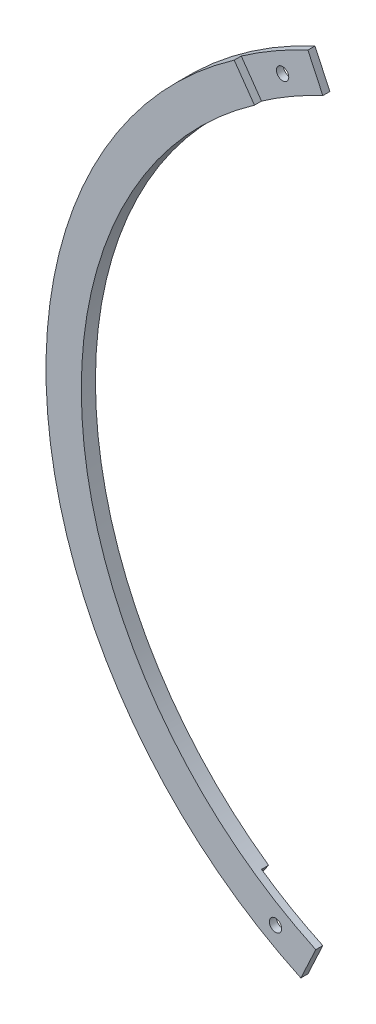
ISO-10303-21;
HEADER;
FILE_DESCRIPTION(('STEP AP214'),'2;1');
FILE_NAME('part.step','',(''),(''),'','','');
FILE_SCHEMA(('AUTOMOTIVE_DESIGN { 1 0 10303 214 1 1 1 1 }'));
ENDSEC;
DATA;
#1=APPLICATION_CONTEXT('core data for automotive mechanical design processes');
#2=APPLICATION_PROTOCOL_DEFINITION('international standard','automotive_design',2000,#1);
#3=PRODUCT_CONTEXT('',#1,'mechanical');
#4=PRODUCT('Part','Part','',(#3));
#5=PRODUCT_RELATED_PRODUCT_CATEGORY('part','',(#4));
#6=PRODUCT_DEFINITION_FORMATION('','',#4);
#7=PRODUCT_DEFINITION_CONTEXT('part definition',#1,'design');
#8=PRODUCT_DEFINITION('design','',#6,#7);
#9=PRODUCT_DEFINITION_SHAPE('','',#8);
#10=(LENGTH_UNIT() NAMED_UNIT(*) SI_UNIT(.MILLI.,.METRE.));
#11=(NAMED_UNIT(*) PLANE_ANGLE_UNIT() SI_UNIT($,.RADIAN.));
#12=(NAMED_UNIT(*) SI_UNIT($,.STERADIAN.) SOLID_ANGLE_UNIT());
#13=UNCERTAINTY_MEASURE_WITH_UNIT(LENGTH_MEASURE(1.E-05),#10,'distance_accuracy_value','');
#14=(GEOMETRIC_REPRESENTATION_CONTEXT(3) GLOBAL_UNCERTAINTY_ASSIGNED_CONTEXT((#13)) GLOBAL_UNIT_ASSIGNED_CONTEXT((#10,
#11,#12)) REPRESENTATION_CONTEXT('',''));
#15=CARTESIAN_POINT('',(0.,0.,0.));
#16=DIRECTION('',(0.,0.,1.));
#17=DIRECTION('',(1.,0.,0.));
#18=AXIS2_PLACEMENT_3D('',#15,#16,#17);
#19=CARTESIAN_POINT('',(0.,0.,4.));
#20=DIRECTION('',(0.,0.,-1.));
#21=DIRECTION('',(-1.,0.,0.));
#22=AXIS2_PLACEMENT_3D('',#19,#20,#21);
#23=CYLINDRICAL_SURFACE('',#22,125.);
#24=CARTESIAN_POINT('',(0.,0.,0.));
#25=DIRECTION('',(0.,0.,1.));
#26=DIRECTION('',(1.,0.,0.));
#27=AXIS2_PLACEMENT_3D('',#24,#25,#26);
#28=CIRCLE('',#27,125.);
#29=CARTESIAN_POINT('',(-52.827282717588,113.288473379581,0.));
#30=VERTEX_POINT('',#29);
#31=CARTESIAN_POINT('',(-71.697054543881,-102.394005536124,0.));
#32=VERTEX_POINT('',#31);
#33=EDGE_CURVE('E145',#30,#32,#28,.T.);
#34=ORIENTED_EDGE('',*,*,#33,.T.);
#35=DIRECTION('',(0.,0.,-1.));
#36=VECTOR('',#35,1.);
#37=CARTESIAN_POINT('',(-71.697054543881,-102.394005536124,2.));
#38=LINE('',#37,#36);
#39=CARTESIAN_POINT('',(-71.697054543881,-102.394005536124,2.));
#40=VERTEX_POINT('',#39);
#41=EDGE_CURVE('E56',#40,#32,#38,.T.);
#42=ORIENTED_EDGE('',*,*,#41,.F.);
#43=CARTESIAN_POINT('',(0.,0.,2.));
#44=DIRECTION('',(0.,0.,-1.));
#45=DIRECTION('',(1.,0.,0.));
#46=AXIS2_PLACEMENT_3D('',#43,#44,#45);
#47=CIRCLE('',#46,125.);
#48=CARTESIAN_POINT('',(-52.827282717588,-113.288473379581,2.));
#49=VERTEX_POINT('',#48);
#50=EDGE_CURVE('E127',#49,#40,#47,.T.);
#51=ORIENTED_EDGE('',*,*,#50,.F.);
#52=DIRECTION('',(0.,0.,-1.));
#53=VECTOR('',#52,1.);
#54=CARTESIAN_POINT('',(-52.827282717588,-113.288473379581,4.));
#55=LINE('',#54,#53);
#56=CARTESIAN_POINT('',(-52.827282717588,-113.288473379581,4.));
#57=VERTEX_POINT('',#56);
#58=EDGE_CURVE('E11',#57,#49,#55,.T.);
#59=ORIENTED_EDGE('',*,*,#58,.F.);
#60=CARTESIAN_POINT('',(0.,0.,4.));
#61=DIRECTION('',(0.,0.,1.));
#62=DIRECTION('',(1.,0.,0.));
#63=AXIS2_PLACEMENT_3D('',#60,#61,#62);
#64=CIRCLE('',#63,125.);
#65=CARTESIAN_POINT('',(-71.6970545438813,102.394005536124,4.));
#66=VERTEX_POINT('',#65);
#67=EDGE_CURVE('E166',#66,#57,#64,.T.);
#68=ORIENTED_EDGE('',*,*,#67,.F.);
#69=DIRECTION('',(0.,0.,1.));
#70=VECTOR('',#69,1.);
#71=CARTESIAN_POINT('',(-71.6970545438814,102.394005536124,2.));
#72=LINE('',#71,#70);
#73=CARTESIAN_POINT('',(-71.6970545438814,102.394005536124,2.));
#74=VERTEX_POINT('',#73);
#75=EDGE_CURVE('E64',#74,#66,#72,.T.);
#76=ORIENTED_EDGE('',*,*,#75,.F.);
#77=CARTESIAN_POINT('',(0.,0.,2.));
#78=DIRECTION('',(0.,0.,1.));
#79=DIRECTION('',(-1.,0.,0.));
#80=AXIS2_PLACEMENT_3D('',#77,#78,#79);
#81=CIRCLE('',#80,125.);
#82=CARTESIAN_POINT('',(-52.827282717588,113.288473379581,2.));
#83=VERTEX_POINT('',#82);
#84=EDGE_CURVE('E189',#83,#74,#81,.T.);
#85=ORIENTED_EDGE('',*,*,#84,.F.);
#86=DIRECTION('',(0.,0.,-1.));
#87=VECTOR('',#86,1.);
#88=CARTESIAN_POINT('',(-52.827282717588,113.288473379581,4.));
#89=LINE('',#88,#87);
#90=EDGE_CURVE('E138',#83,#30,#89,.T.);
#91=ORIENTED_EDGE('',*,*,#90,.T.);
#92=EDGE_LOOP('',(#34,#42,#51,#59,#68,#76,#85,#91));
#93=FACE_BOUND('',#92,.T.);
#94=ADVANCED_FACE('F39',(#93),#23,.T.);
#95=CARTESIAN_POINT('',(-48.6011001001809,-104.225395509215,4.));
#96=DIRECTION('',(-0.906307787036648,0.422618261740703,0.));
#97=DIRECTION('',(-0.422618261740703,-0.906307787036648,0.));
#98=AXIS2_PLACEMENT_3D('',#95,#96,#97);
#99=PLANE('',#98);
#100=ORIENTED_EDGE('',*,*,#58,.T.);
#101=DIRECTION('',(-0.422618261740696,-0.906307787036651,0.));
#102=VECTOR('',#101,1.);
#103=CARTESIAN_POINT('',(-48.601100100181,-104.225395509215,2.));
#104=LINE('',#103,#102);
#105=CARTESIAN_POINT('',(-48.601100100181,-104.225395509215,2.));
#106=VERTEX_POINT('',#105);
#107=EDGE_CURVE('E111',#106,#49,#104,.T.);
#108=ORIENTED_EDGE('',*,*,#107,.F.);
#109=DIRECTION('',(0.,0.,-1.));
#110=VECTOR('',#109,1.);
#111=CARTESIAN_POINT('',(-48.601100100181,-104.225395509215,4.));
#112=LINE('',#111,#110);
#113=CARTESIAN_POINT('',(-48.601100100181,-104.225395509215,4.));
#114=VERTEX_POINT('',#113);
#115=EDGE_CURVE('E48',#114,#106,#112,.T.);
#116=ORIENTED_EDGE('',*,*,#115,.F.);
#117=DIRECTION('',(0.422618261740703,0.906307787036648,0.));
#118=VECTOR('',#117,1.);
#119=CARTESIAN_POINT('',(-48.6011001001809,-104.225395509215,4.));
#120=LINE('',#119,#118);
#121=EDGE_CURVE('E169',#57,#114,#120,.T.);
#122=ORIENTED_EDGE('',*,*,#121,.F.);
#123=EDGE_LOOP('',(#100,#108,#116,#122));
#124=FACE_BOUND('',#123,.T.);
#125=ADVANCED_FACE('F122',(#124),#99,.F.);
#126=CARTESIAN_POINT('',(0.,0.,4.));
#127=DIRECTION('',(0.,0.,-1.));
#128=DIRECTION('',(-1.,0.,0.));
#129=AXIS2_PLACEMENT_3D('',#126,#127,#128);
#130=CYLINDRICAL_SURFACE('',#129,115.);
#131=CARTESIAN_POINT('',(0.,0.,2.));
#132=DIRECTION('',(0.,0.,1.));
#133=DIRECTION('',(1.,0.,0.));
#134=AXIS2_PLACEMENT_3D('',#131,#132,#133);
#135=CIRCLE('',#134,115.);
#136=CARTESIAN_POINT('',(-65.9612901803705,-94.2024850932339,2.));
#137=VERTEX_POINT('',#136);
#138=EDGE_CURVE('E107',#137,#106,#135,.T.);
#139=ORIENTED_EDGE('',*,*,#138,.F.);
#140=DIRECTION('',(0.,0.,-1.));
#141=VECTOR('',#140,1.);
#142=CARTESIAN_POINT('',(-65.9612901803705,-94.2024850932339,2.));
#143=LINE('',#142,#141);
#144=CARTESIAN_POINT('',(-65.9612901803705,-94.2024850932339,0.));
#145=VERTEX_POINT('',#144);
#146=EDGE_CURVE('E199',#137,#145,#143,.T.);
#147=ORIENTED_EDGE('',*,*,#146,.T.);
#148=CARTESIAN_POINT('',(0.,0.,0.));
#149=DIRECTION('',(0.,0.,-1.));
#150=DIRECTION('',(1.,0.,0.));
#151=AXIS2_PLACEMENT_3D('',#148,#149,#150);
#152=CIRCLE('',#151,115.);
#153=CARTESIAN_POINT('',(-48.601100100181,104.225395509215,0.));
#154=VERTEX_POINT('',#153);
#155=EDGE_CURVE('E178',#145,#154,#152,.T.);
#156=ORIENTED_EDGE('',*,*,#155,.T.);
#157=DIRECTION('',(0.,0.,-1.));
#158=VECTOR('',#157,1.);
#159=CARTESIAN_POINT('',(-48.601100100181,104.225395509215,4.));
#160=LINE('',#159,#158);
#161=CARTESIAN_POINT('',(-48.601100100181,104.225395509214,2.));
#162=VERTEX_POINT('',#161);
#163=EDGE_CURVE('E134',#162,#154,#160,.T.);
#164=ORIENTED_EDGE('',*,*,#163,.F.);
#165=CARTESIAN_POINT('',(0.,0.,2.));
#166=DIRECTION('',(0.,0.,-1.));
#167=DIRECTION('',(1.,0.,0.));
#168=AXIS2_PLACEMENT_3D('',#165,#166,#167);
#169=CIRCLE('',#168,115.);
#170=CARTESIAN_POINT('',(-65.9612901803709,94.2024850932336,2.));
#171=VERTEX_POINT('',#170);
#172=EDGE_CURVE('E198',#171,#162,#169,.T.);
#173=ORIENTED_EDGE('',*,*,#172,.F.);
#174=DIRECTION('',(0.,0.,1.));
#175=VECTOR('',#174,1.);
#176=CARTESIAN_POINT('',(-65.9612901803709,94.2024850932336,2.));
#177=LINE('',#176,#175);
#178=CARTESIAN_POINT('',(-65.9612901803709,94.2024850932336,4.));
#179=VERTEX_POINT('',#178);
#180=EDGE_CURVE('E150',#171,#179,#177,.T.);
#181=ORIENTED_EDGE('',*,*,#180,.T.);
#182=CARTESIAN_POINT('',(0.,0.,4.));
#183=DIRECTION('',(0.,0.,-1.));
#184=DIRECTION('',(1.,0.,0.));
#185=AXIS2_PLACEMENT_3D('',#182,#183,#184);
#186=CIRCLE('',#185,115.);
#187=EDGE_CURVE('E132',#114,#179,#186,.T.);
#188=ORIENTED_EDGE('',*,*,#187,.F.);
#189=ORIENTED_EDGE('',*,*,#115,.T.);
#190=EDGE_LOOP('',(#139,#147,#156,#164,#173,#181,#188,#189));
#191=FACE_BOUND('',#190,.T.);
#192=ADVANCED_FACE('F129',(#191),#130,.F.);
#193=CARTESIAN_POINT('',(-48.601100100181,104.225395509215,4.));
#194=DIRECTION('',(-0.906307787036648,-0.422618261740704,0.));
#195=DIRECTION('',(0.422618261740704,-0.906307787036648,0.));
#196=AXIS2_PLACEMENT_3D('',#193,#194,#195);
#197=PLANE('',#196);
#198=ORIENTED_EDGE('',*,*,#90,.F.);
#199=DIRECTION('',(-0.422618261740704,0.906307787036648,0.));
#200=VECTOR('',#199,1.);
#201=CARTESIAN_POINT('',(-52.827282717588,113.288473379581,2.));
#202=LINE('',#201,#200);
#203=EDGE_CURVE('E160',#162,#83,#202,.T.);
#204=ORIENTED_EDGE('',*,*,#203,.F.);
#205=ORIENTED_EDGE('',*,*,#163,.T.);
#206=DIRECTION('',(-0.422618261740704,0.906307787036648,0.));
#207=VECTOR('',#206,1.);
#208=CARTESIAN_POINT('',(-48.601100100181,104.225395509215,0.));
#209=LINE('',#208,#207);
#210=EDGE_CURVE('E170',#154,#30,#209,.T.);
#211=ORIENTED_EDGE('',*,*,#210,.T.);
#212=EDGE_LOOP('',(#198,#204,#205,#211));
#213=FACE_BOUND('',#212,.T.);
#214=ADVANCED_FACE('F196',(#213),#197,.F.);
#215=CARTESIAN_POINT('',(0.,0.,4.));
#216=DIRECTION('',(0.,0.,1.));
#217=DIRECTION('',(1.,0.,0.));
#218=AXIS2_PLACEMENT_3D('',#215,#216,#217);
#219=PLANE('',#218);
#220=DIRECTION('',(0.57357643635105,-0.819152044288989,0.));
#221=VECTOR('',#220,1.);
#222=CARTESIAN_POINT('',(-71.6970545438814,102.394005536124,4.));
#223=LINE('',#222,#221);
#224=EDGE_CURVE('E163',#66,#179,#223,.T.);
#225=ORIENTED_EDGE('',*,*,#224,.F.);
#226=ORIENTED_EDGE('',*,*,#67,.T.);
#227=ORIENTED_EDGE('',*,*,#121,.T.);
#228=ORIENTED_EDGE('',*,*,#187,.T.);
#229=EDGE_LOOP('',(#225,#226,#227,#228));
#230=FACE_BOUND('',#229,.T.);
#231=CARTESIAN_POINT('',(-59.9999999999997,-103.923048454133,4.));
#232=DIRECTION('',(0.,0.,1.));
#233=DIRECTION('',(1.,0.,0.));
#234=AXIS2_PLACEMENT_3D('',#231,#232,#233);
#235=CIRCLE('',#234,1.75000000000006);
#236=CARTESIAN_POINT('',(-58.2499999999996,-103.923048454133,4.));
#237=VERTEX_POINT('',#236);
#238=EDGE_CURVE('E146',#237,#237,#235,.T.);
#239=ORIENTED_EDGE('',*,*,#238,.F.);
#240=EDGE_LOOP('',(#239));
#241=FACE_BOUND('',#240,.T.);
#242=ADVANCED_FACE('F224',(#230,#241),#219,.T.);
#243=CARTESIAN_POINT('',(0.,0.,0.));
#244=DIRECTION('',(0.,0.,1.));
#245=DIRECTION('',(1.,0.,0.));
#246=AXIS2_PLACEMENT_3D('',#243,#244,#245);
#247=PLANE('',#246);
#248=CARTESIAN_POINT('',(-60.0000000000005,103.923048454132,0.));
#249=DIRECTION('',(0.,0.,1.));
#250=DIRECTION('',(1.,0.,0.));
#251=AXIS2_PLACEMENT_3D('',#248,#249,#250);
#252=CIRCLE('',#251,1.74999999999996);
#253=CARTESIAN_POINT('',(-58.2500000000006,103.923048454132,0.));
#254=VERTEX_POINT('',#253);
#255=EDGE_CURVE('E142',#254,#254,#252,.T.);
#256=ORIENTED_EDGE('',*,*,#255,.T.);
#257=EDGE_LOOP('',(#256));
#258=FACE_BOUND('',#257,.T.);
#259=ORIENTED_EDGE('',*,*,#155,.F.);
#260=DIRECTION('',(0.573576436351046,0.819152044288992,0.));
#261=VECTOR('',#260,1.);
#262=CARTESIAN_POINT('',(-65.9612901803705,-94.2024850932339,0.));
#263=LINE('',#262,#261);
#264=EDGE_CURVE('E118',#32,#145,#263,.T.);
#265=ORIENTED_EDGE('',*,*,#264,.F.);
#266=ORIENTED_EDGE('',*,*,#33,.F.);
#267=ORIENTED_EDGE('',*,*,#210,.F.);
#268=EDGE_LOOP('',(#259,#265,#266,#267));
#269=FACE_BOUND('',#268,.T.);
#270=ADVANCED_FACE('F195',(#258,#269),#247,.F.);
#271=CARTESIAN_POINT('',(-59.9999999999997,-103.923048454133,-6.));
#272=DIRECTION('',(0.,0.,1.));
#273=DIRECTION('',(1.,0.,0.));
#274=AXIS2_PLACEMENT_3D('',#271,#272,#273);
#275=CYLINDRICAL_SURFACE('',#274,1.75000000000006);
#276=CARTESIAN_POINT('',(-59.9999999999997,-103.923048454133,2.));
#277=DIRECTION('',(0.,0.,1.));
#278=DIRECTION('',(1.,0.,0.));
#279=AXIS2_PLACEMENT_3D('',#276,#277,#278);
#280=CIRCLE('',#279,1.75000000000006);
#281=CARTESIAN_POINT('',(-58.2499999999996,-103.923048454133,2.));
#282=VERTEX_POINT('',#281);
#283=EDGE_CURVE('E42',#282,#282,#280,.F.);
#284=ORIENTED_EDGE('',*,*,#283,.T.);
#285=EDGE_LOOP('',(#284));
#286=FACE_BOUND('',#285,.T.);
#287=ORIENTED_EDGE('',*,*,#238,.T.);
#288=EDGE_LOOP('',(#287));
#289=FACE_BOUND('',#288,.T.);
#290=ADVANCED_FACE('F251',(#286,#289),#275,.F.);
#291=CARTESIAN_POINT('',(-60.0000000000005,103.923048454132,-6.));
#292=DIRECTION('',(0.,0.,1.));
#293=DIRECTION('',(1.,0.,0.));
#294=AXIS2_PLACEMENT_3D('',#291,#292,#293);
#295=CYLINDRICAL_SURFACE('',#294,1.74999999999996);
#296=CARTESIAN_POINT('',(-60.0000000000005,103.923048454132,2.));
#297=DIRECTION('',(0.,0.,-1.));
#298=DIRECTION('',(-1.,0.,0.));
#299=AXIS2_PLACEMENT_3D('',#296,#297,#298);
#300=CIRCLE('',#299,1.74999999999996);
#301=CARTESIAN_POINT('',(-61.7500000000005,103.923048454132,2.));
#302=VERTEX_POINT('',#301);
#303=EDGE_CURVE('E147',#302,#302,#300,.F.);
#304=ORIENTED_EDGE('',*,*,#303,.T.);
#305=EDGE_LOOP('',(#304));
#306=FACE_BOUND('',#305,.T.);
#307=ORIENTED_EDGE('',*,*,#255,.F.);
#308=EDGE_LOOP('',(#307));
#309=FACE_BOUND('',#308,.T.);
#310=ADVANCED_FACE('F257',(#306,#309),#295,.F.);
#311=CARTESIAN_POINT('',(0.,0.,2.));
#312=DIRECTION('',(0.,0.,-1.));
#313=DIRECTION('',(-1.,0.,0.));
#314=AXIS2_PLACEMENT_3D('',#311,#312,#313);
#315=PLANE('',#314);
#316=ORIENTED_EDGE('',*,*,#84,.T.);
#317=DIRECTION('',(0.57357643635105,-0.819152044288989,0.));
#318=VECTOR('',#317,1.);
#319=CARTESIAN_POINT('',(-71.6970545438814,102.394005536124,2.));
#320=LINE('',#319,#318);
#321=EDGE_CURVE('E211',#74,#171,#320,.T.);
#322=ORIENTED_EDGE('',*,*,#321,.T.);
#323=ORIENTED_EDGE('',*,*,#172,.T.);
#324=ORIENTED_EDGE('',*,*,#203,.T.);
#325=EDGE_LOOP('',(#316,#322,#323,#324));
#326=FACE_BOUND('',#325,.T.);
#327=ORIENTED_EDGE('',*,*,#303,.F.);
#328=EDGE_LOOP('',(#327));
#329=FACE_BOUND('',#328,.T.);
#330=ADVANCED_FACE('F218',(#326,#329),#315,.F.);
#331=CARTESIAN_POINT('',(-71.6970545438814,102.394005536124,2.));
#332=DIRECTION('',(-0.819152044288989,-0.57357643635105,0.));
#333=DIRECTION('',(0.57357643635105,-0.819152044288989,0.));
#334=AXIS2_PLACEMENT_3D('',#331,#332,#333);
#335=PLANE('',#334);
#336=ORIENTED_EDGE('',*,*,#224,.T.);
#337=ORIENTED_EDGE('',*,*,#180,.F.);
#338=ORIENTED_EDGE('',*,*,#321,.F.);
#339=ORIENTED_EDGE('',*,*,#75,.T.);
#340=EDGE_LOOP('',(#336,#337,#338,#339));
#341=FACE_BOUND('',#340,.T.);
#342=ADVANCED_FACE('F220',(#341),#335,.F.);
#343=CARTESIAN_POINT('',(0.,0.,2.));
#344=DIRECTION('',(0.,0.,1.));
#345=DIRECTION('',(1.,0.,0.));
#346=AXIS2_PLACEMENT_3D('',#343,#344,#345);
#347=PLANE('',#346);
#348=ORIENTED_EDGE('',*,*,#138,.T.);
#349=ORIENTED_EDGE('',*,*,#107,.T.);
#350=ORIENTED_EDGE('',*,*,#50,.T.);
#351=DIRECTION('',(0.573576436351046,0.819152044288992,0.));
#352=VECTOR('',#351,1.);
#353=CARTESIAN_POINT('',(-65.9612901803705,-94.2024850932339,2.));
#354=LINE('',#353,#352);
#355=EDGE_CURVE('E113',#40,#137,#354,.T.);
#356=ORIENTED_EDGE('',*,*,#355,.T.);
#357=EDGE_LOOP('',(#348,#349,#350,#356));
#358=FACE_BOUND('',#357,.T.);
#359=ORIENTED_EDGE('',*,*,#283,.F.);
#360=EDGE_LOOP('',(#359));
#361=FACE_BOUND('',#360,.T.);
#362=ADVANCED_FACE('F109',(#358,#361),#347,.F.);
#363=CARTESIAN_POINT('',(-65.9612901803705,-94.2024850932339,2.));
#364=DIRECTION('',(-0.819152044288992,0.573576436351046,0.));
#365=DIRECTION('',(-0.573576436351046,-0.819152044288992,0.));
#366=AXIS2_PLACEMENT_3D('',#363,#364,#365);
#367=PLANE('',#366);
#368=ORIENTED_EDGE('',*,*,#264,.T.);
#369=ORIENTED_EDGE('',*,*,#146,.F.);
#370=ORIENTED_EDGE('',*,*,#355,.F.);
#371=ORIENTED_EDGE('',*,*,#41,.T.);
#372=EDGE_LOOP('',(#368,#369,#370,#371));
#373=FACE_BOUND('',#372,.T.);
#374=ADVANCED_FACE('F230',(#373),#367,.F.);
#375=CLOSED_SHELL('',(#94,#125,#192,#214,#242,#270,#290,#310,#330,#342,#362,#374));
#376=MANIFOLD_SOLID_BREP('B2',#375);
#377=ADVANCED_BREP_SHAPE_REPRESENTATION('',(#18,#376),#14);
#378=SHAPE_DEFINITION_REPRESENTATION(#9,#377);
ENDSEC;
END-ISO-10303-21;
